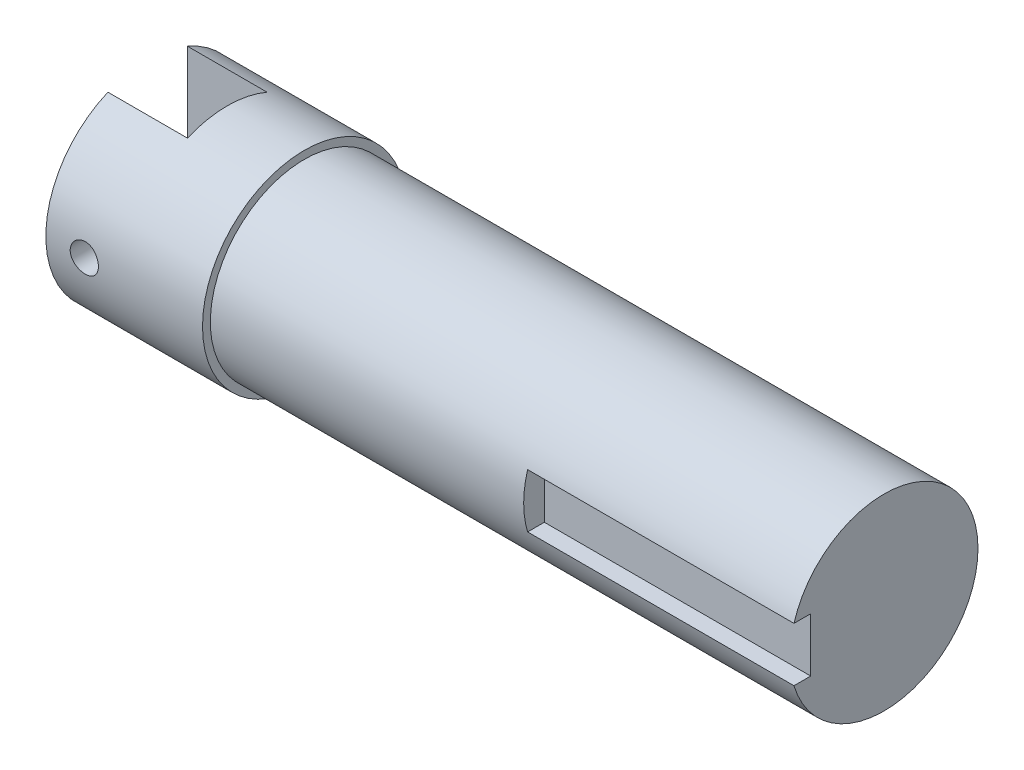
ISO-10303-21;
HEADER;
FILE_DESCRIPTION(('STEP AP214'),'2;1');
FILE_NAME('part.step','',(''),(''),'','','');
FILE_SCHEMA(('AUTOMOTIVE_DESIGN { 1 0 10303 214 1 1 1 1 }'));
ENDSEC;
DATA;
#1=APPLICATION_CONTEXT('core data for automotive mechanical design processes');
#2=APPLICATION_PROTOCOL_DEFINITION('international standard','automotive_design',2000,#1);
#3=PRODUCT_CONTEXT('',#1,'mechanical');
#4=PRODUCT('Part','Part','',(#3));
#5=PRODUCT_RELATED_PRODUCT_CATEGORY('part','',(#4));
#6=PRODUCT_DEFINITION_FORMATION('','',#4);
#7=PRODUCT_DEFINITION_CONTEXT('part definition',#1,'design');
#8=PRODUCT_DEFINITION('design','',#6,#7);
#9=PRODUCT_DEFINITION_SHAPE('','',#8);
#10=(LENGTH_UNIT() NAMED_UNIT(*) SI_UNIT(.MILLI.,.METRE.));
#11=(NAMED_UNIT(*) PLANE_ANGLE_UNIT() SI_UNIT($,.RADIAN.));
#12=(NAMED_UNIT(*) SI_UNIT($,.STERADIAN.) SOLID_ANGLE_UNIT());
#13=UNCERTAINTY_MEASURE_WITH_UNIT(LENGTH_MEASURE(1.E-05),#10,'distance_accuracy_value','');
#14=(GEOMETRIC_REPRESENTATION_CONTEXT(3) GLOBAL_UNCERTAINTY_ASSIGNED_CONTEXT((#13)) GLOBAL_UNIT_ASSIGNED_CONTEXT((#10,
#11,#12)) REPRESENTATION_CONTEXT('',''));
#15=CARTESIAN_POINT('',(0.,0.,0.));
#16=DIRECTION('',(0.,0.,1.));
#17=DIRECTION('',(1.,0.,0.));
#18=AXIS2_PLACEMENT_3D('',#15,#16,#17);
#19=CARTESIAN_POINT('',(-50.,0.,0.));
#20=DIRECTION('',(1.,0.,0.));
#21=DIRECTION('',(0.,0.,-1.));
#22=AXIS2_PLACEMENT_3D('',#19,#20,#21);
#23=CYLINDRICAL_SURFACE('',#22,32.5);
#24=CARTESIAN_POINT('',(0.,0.,0.));
#25=DIRECTION('',(-1.,0.,0.));
#26=DIRECTION('',(0.,0.,1.));
#27=AXIS2_PLACEMENT_3D('',#24,#25,#26);
#28=CIRCLE('',#27,32.5);
#29=CARTESIAN_POINT('',(0.,0.,32.5));
#30=VERTEX_POINT('',#29);
#31=EDGE_CURVE('E143',#30,#30,#28,.T.);
#32=ORIENTED_EDGE('',*,*,#31,.T.);
#33=EDGE_LOOP('',(#32));
#34=FACE_BOUND('',#33,.T.);
#35=DIRECTION('',(1.,0.,0.));
#36=VECTOR('',#35,1.);
#37=CARTESIAN_POINT('',(-50.,29.915882069563,12.7));
#38=LINE('',#37,#36);
#39=CARTESIAN_POINT('',(-50.,29.915882069563,12.7));
#40=VERTEX_POINT('',#39);
#41=CARTESIAN_POINT('',(-24.6,29.915882069563,12.7));
#42=VERTEX_POINT('',#41);
#43=EDGE_CURVE('E171',#40,#42,#38,.T.);
#44=ORIENTED_EDGE('',*,*,#43,.F.);
#45=CARTESIAN_POINT('',(-50.,0.,0.));
#46=DIRECTION('',(-1.,0.,0.));
#47=DIRECTION('',(0.,0.,1.));
#48=AXIS2_PLACEMENT_3D('',#45,#46,#47);
#49=CIRCLE('',#48,32.5);
#50=CARTESIAN_POINT('',(-50.,-29.915882069563,12.7));
#51=VERTEX_POINT('',#50);
#52=EDGE_CURVE('E135',#51,#40,#49,.T.);
#53=ORIENTED_EDGE('',*,*,#52,.F.);
#54=DIRECTION('',(1.,0.,0.));
#55=VECTOR('',#54,1.);
#56=CARTESIAN_POINT('',(-50.,-29.915882069563,12.7));
#57=LINE('',#56,#55);
#58=CARTESIAN_POINT('',(-24.6,-29.915882069563,12.7));
#59=VERTEX_POINT('',#58);
#60=EDGE_CURVE('E170',#59,#51,#57,.F.);
#61=ORIENTED_EDGE('',*,*,#60,.F.);
#62=CARTESIAN_POINT('',(-24.6,0.,0.));
#63=DIRECTION('',(-1.,0.,0.));
#64=DIRECTION('',(0.,0.,1.));
#65=AXIS2_PLACEMENT_3D('',#62,#63,#64);
#66=CIRCLE('',#65,32.5);
#67=CARTESIAN_POINT('',(-24.6,-29.915882069563,-12.7));
#68=VERTEX_POINT('',#67);
#69=EDGE_CURVE('E55',#68,#59,#66,.T.);
#70=ORIENTED_EDGE('',*,*,#69,.F.);
#71=DIRECTION('',(1.,0.,0.));
#72=VECTOR('',#71,1.);
#73=CARTESIAN_POINT('',(-50.,-29.915882069563,-12.7));
#74=LINE('',#73,#72);
#75=CARTESIAN_POINT('',(-50.,-29.915882069563,-12.7));
#76=VERTEX_POINT('',#75);
#77=EDGE_CURVE('E114',#68,#76,#74,.F.);
#78=ORIENTED_EDGE('',*,*,#77,.T.);
#79=CARTESIAN_POINT('',(-50.,29.915882069563,-12.7));
#80=VERTEX_POINT('',#79);
#81=EDGE_CURVE('E127',#80,#76,#49,.T.);
#82=ORIENTED_EDGE('',*,*,#81,.F.);
#83=DIRECTION('',(1.,0.,0.));
#84=VECTOR('',#83,1.);
#85=CARTESIAN_POINT('',(-50.,29.915882069563,-12.7));
#86=LINE('',#85,#84);
#87=CARTESIAN_POINT('',(-24.6,29.915882069563,-12.7));
#88=VERTEX_POINT('',#87);
#89=EDGE_CURVE('E62',#80,#88,#86,.T.);
#90=ORIENTED_EDGE('',*,*,#89,.T.);
#91=EDGE_CURVE('E11',#42,#88,#66,.T.);
#92=ORIENTED_EDGE('',*,*,#91,.F.);
#93=EDGE_LOOP('',(#44,#53,#61,#70,#78,#82,#90,#92));
#94=FACE_BOUND('',#93,.T.);
#95=CARTESIAN_POINT('',(-42.2297556983694,0.,32.5));
#96=CARTESIAN_POINT('',(-42.2297451677036,-0.251476713775578,32.4999961967984));
#97=CARTESIAN_POINT('',(-42.2086043939546,-0.50310478940474,32.4970505017367));
#98=CARTESIAN_POINT('',(-42.1246126299622,-0.999342758172016,32.4855829606299));
#99=CARTESIAN_POINT('',(-42.0617196039774,-1.2439453189056,32.4770554950366));
#100=CARTESIAN_POINT('',(-41.8961257537616,-1.71887765065578,32.4553838558711));
#101=CARTESIAN_POINT('',(-41.7934534322544,-1.94921750446027,32.4422429885323));
#102=CARTESIAN_POINT('',(-41.551281715441,-2.38935903564809,32.4128011760166));
#103=CARTESIAN_POINT('',(-41.4117880134298,-2.59916388127082,32.3965007194765));
#104=CARTESIAN_POINT('',(-41.0989361055868,-2.99372458135041,32.3624338055038));
#105=CARTESIAN_POINT('',(-40.9253801831463,-3.17832297301913,32.34465915659));
#106=CARTESIAN_POINT('',(-40.5497555990823,-3.51587326350804,32.3097122100158));
#107=CARTESIAN_POINT('',(-40.3476853918274,-3.66882344571174,32.2925399450709));
#108=CARTESIAN_POINT('',(-39.9197263672851,-3.9393363293882,32.2606621888148));
#109=CARTESIAN_POINT('',(-39.6937418159321,-4.05674893091849,32.2459672736233));
#110=CARTESIAN_POINT('',(-39.2250236093747,-4.25189485531683,32.2208182714461));
#111=CARTESIAN_POINT('',(-38.9822907321945,-4.32963001994773,32.2103639876219));
#112=CARTESIAN_POINT('',(-38.4886125042317,-4.44273029607437,32.1949595049808));
#113=CARTESIAN_POINT('',(-38.2377296385564,-4.47836332950903,32.1899745163225));
#114=CARTESIAN_POINT('',(-37.7334994758609,-4.5070773930153,32.1859670703542));
#115=CARTESIAN_POINT('',(-37.4801523003613,-4.50016051080444,32.186944320506));
#116=CARTESIAN_POINT('',(-36.9800653733341,-4.44419050668617,32.1947191037414));
#117=CARTESIAN_POINT('',(-36.7332916745216,-4.39543419051841,32.2014756379387));
#118=CARTESIAN_POINT('',(-36.2514622501809,-4.25763321097773,32.2199837109791));
#119=CARTESIAN_POINT('',(-36.0164068111022,-4.16858756327952,32.2317353718596));
#120=CARTESIAN_POINT('',(-35.5637740311881,-3.95242192943067,32.258955464481));
#121=CARTESIAN_POINT('',(-35.3462582569872,-3.82517465201875,32.274436287503));
#122=CARTESIAN_POINT('',(-34.9355545139508,-3.53630868635925,32.3073611719864));
#123=CARTESIAN_POINT('',(-34.7423679093103,-3.37468807208104,32.3248053434336));
#124=CARTESIAN_POINT('',(-34.3840849204299,-3.02002643822979,32.3598731155141));
#125=CARTESIAN_POINT('',(-34.2192413761775,-2.82672991685896,32.377496980523));
#126=CARTESIAN_POINT('',(-33.9242981803474,-2.41507855285903,32.4108001416562));
#127=CARTESIAN_POINT('',(-33.7941986430385,-2.19672362781936,32.4264794313849));
#128=CARTESIAN_POINT('',(-33.5724297309782,-1.7409462909971,32.454139828637));
#129=CARTESIAN_POINT('',(-33.4807780842477,-1.50351514330564,32.4661192295007));
#130=CARTESIAN_POINT('',(-33.3387171528008,-1.01642945157678,32.4850153198952));
#131=CARTESIAN_POINT('',(-33.2883054956737,-0.766775611549387,32.4919323006493));
#132=CARTESIAN_POINT('',(-33.2304876344266,-0.264515392173606,32.4998859786858));
#133=CARTESIAN_POINT('',(-33.2227334939367,-0.0119497903126556,32.5009702489016));
#134=CARTESIAN_POINT('',(-33.2495298205025,0.490877663116604,32.4972653278649));
#135=CARTESIAN_POINT('',(-33.2840791766062,0.741139575009299,32.492476290854));
#136=CARTESIAN_POINT('',(-33.3942125537434,1.23121489955244,32.4775923445856));
#137=CARTESIAN_POINT('',(-33.4696288059083,1.47106672978644,32.4675191335522));
#138=CARTESIAN_POINT('',(-33.6591794744278,1.9347203432569,32.4431934987228));
#139=CARTESIAN_POINT('',(-33.7733154709711,2.15852147099768,32.4289409043654));
#140=CARTESIAN_POINT('',(-34.0378943302182,2.58526237363048,32.3977242682124));
#141=CARTESIAN_POINT('',(-34.1885600150641,2.78806277681038,32.3807438102731));
#142=CARTESIAN_POINT('',(-34.5216087771067,3.16562300652935,32.3460174684232));
#143=CARTESIAN_POINT('',(-34.7039934123805,3.34038145479911,32.3282715469443));
#144=CARTESIAN_POINT('',(-35.0968440652709,3.6581478575641,32.2938654474841));
#145=CARTESIAN_POINT('',(-35.3074986019274,3.80092380777263,32.2772137856068));
#146=CARTESIAN_POINT('',(-35.7500037230946,4.04906448092933,32.2470272710179));
#147=CARTESIAN_POINT('',(-35.981853803799,4.15443009281,32.2334923442501));
#148=CARTESIAN_POINT('',(-36.4594494351649,4.32439176902625,32.2111317882919));
#149=CARTESIAN_POINT('',(-36.7051493298058,4.38911412693432,32.2022915842129));
#150=CARTESIAN_POINT('',(-37.2040616468359,4.47635645326582,32.1902812136673));
#151=CARTESIAN_POINT('',(-37.4572736323055,4.49887887126019,32.1871107180928));
#152=CARTESIAN_POINT('',(-37.9617121732623,4.50103014338553,32.1868097608989));
#153=CARTESIAN_POINT('',(-38.2129372200853,4.48102361290709,32.189627956089));
#154=CARTESIAN_POINT('',(-38.7084151715534,4.39946178518042,32.2008758407262));
#155=CARTESIAN_POINT('',(-38.9526680811706,4.33790651756229,32.2093055261716));
#156=CARTESIAN_POINT('',(-39.4271927753685,4.17511639123033,32.2308096274505));
#157=CARTESIAN_POINT('',(-39.6574721228238,4.07390322170887,32.2438815040708));
#158=CARTESIAN_POINT('',(-40.0978390927872,3.83470625888075,32.2732007003367));
#159=CARTESIAN_POINT('',(-40.3079262376124,3.69672159596941,32.2894480950772));
#160=CARTESIAN_POINT('',(-40.703803558774,3.38655978128656,32.323454064158));
#161=CARTESIAN_POINT('',(-40.8893804723867,3.21411164277081,32.3412239332684));
#162=CARTESIAN_POINT('',(-41.2290957062609,2.84048892484938,32.3761756740433));
#163=CARTESIAN_POINT('',(-41.3832266632331,2.63930763608215,32.3933574072095));
#164=CARTESIAN_POINT('',(-41.6563042237974,2.21283684805816,32.4252872449895));
#165=CARTESIAN_POINT('',(-41.7750834277696,1.98743931655715,32.4400236291611));
#166=CARTESIAN_POINT('',(-41.9729275895558,1.51980664796643,32.4652860630007));
#167=CARTESIAN_POINT('',(-42.0520346619281,1.27758967821949,32.4758165750478));
#168=CARTESIAN_POINT('',(-42.1498611194011,0.861835746844076,32.489011430211));
#169=CARTESIAN_POINT('',(-42.1797771351664,0.690893363532976,32.4931115113834));
#170=CARTESIAN_POINT('',(-42.2197279568701,0.346657949921302,32.4986070939359));
#171=CARTESIAN_POINT('',(-42.2297629580804,0.173364942725462,32.5000026218803));
#172=CARTESIAN_POINT('',(-42.2297556983694,0.,32.5));
#173=B_SPLINE_CURVE_WITH_KNOTS('',3,(#95,#96,#97,#98,#99,#100,#101,#102,#103,#104,#105,#106,
#107,#108,#109,#110,#111,#112,#113,#114,#115,#116,#117,#118,#119,#120,#121,#122,#123,#124,#125,
#126,#127,#128,#129,#130,#131,#132,#133,#134,#135,#136,#137,#138,#139,#140,#141,#142,#143,#144,
#145,#146,#147,#148,#149,#150,#151,#152,#153,#154,#155,#156,#157,#158,#159,#160,#161,#162,#163,
#164,#165,#166,#167,#168,#169,#170,#171,#172),.UNSPECIFIED.,.T.,.F.,(4,2,2,2,2,2,2,2,2,2,2,2,2,
2,2,2,2,2,2,2,2,2,2,2,2,2,2,2,2,2,2,2,2,2,2,2,2,2,4),(0.,0.753796769010256,1.50835360619536,
2.2623707840264,3.01627144448885,3.77468500241174,4.53313968633046,5.29475453026309,
6.05633401804302,6.81304054510393,7.5697099445499,8.32105554826591,9.0724195094075,
9.82631540716196,10.5802535588686,11.3406029574705,12.1009548567352,12.8616569639685,
13.6223153072524,14.3767600322741,15.1311849448957,15.8825359613667,16.6339176448591,
17.3900032766185,18.1461260588065,18.9075679559686,19.6689917587806,20.4280376745418,
21.1870395287609,21.9395604543382,22.6920808432625,23.4441902465277,24.1963174379175,
24.9546093969473,25.7130787120364,26.4750844303599,27.2362795084214,27.7559428017142,
28.2756009908328),.UNSPECIFIED.);
#174=CARTESIAN_POINT('',(-42.2297556983694,0.,32.5));
#175=VERTEX_POINT('',#174);
#176=EDGE_CURVE('E253',#175,#175,#173,.T.);
#177=ORIENTED_EDGE('',*,*,#176,.F.);
#178=EDGE_LOOP('',(#177));
#179=FACE_BOUND('',#178,.T.);
#180=CARTESIAN_POINT('',(-42.2297556983694,0.,-32.5));
#181=CARTESIAN_POINT('',(-42.2297451677036,0.251476713775578,-32.4999961967984));
#182=CARTESIAN_POINT('',(-42.2086043939546,0.50310478940474,-32.4970505017367));
#183=CARTESIAN_POINT('',(-42.1246126299622,0.999342758172016,-32.4855829606299));
#184=CARTESIAN_POINT('',(-42.0617196039774,1.2439453189056,-32.4770554950366));
#185=CARTESIAN_POINT('',(-41.8961257537616,1.71887765065578,-32.4553838558711));
#186=CARTESIAN_POINT('',(-41.7934534322544,1.94921750446027,-32.4422429885323));
#187=CARTESIAN_POINT('',(-41.551281715441,2.38935903564809,-32.4128011760166));
#188=CARTESIAN_POINT('',(-41.4117880134298,2.59916388127082,-32.3965007194765));
#189=CARTESIAN_POINT('',(-41.0989361055868,2.99372458135041,-32.3624338055038));
#190=CARTESIAN_POINT('',(-40.9253801831463,3.17832297301913,-32.34465915659));
#191=CARTESIAN_POINT('',(-40.5497555990823,3.51587326350804,-32.3097122100158));
#192=CARTESIAN_POINT('',(-40.3476853918274,3.66882344571174,-32.2925399450709));
#193=CARTESIAN_POINT('',(-39.9197263672851,3.9393363293882,-32.2606621888148));
#194=CARTESIAN_POINT('',(-39.6937418159321,4.05674893091849,-32.2459672736233));
#195=CARTESIAN_POINT('',(-39.2250236093747,4.25189485531683,-32.2208182714461));
#196=CARTESIAN_POINT('',(-38.9822907321945,4.32963001994773,-32.2103639876219));
#197=CARTESIAN_POINT('',(-38.4886125042317,4.44273029607437,-32.1949595049808));
#198=CARTESIAN_POINT('',(-38.2377296385564,4.47836332950903,-32.1899745163225));
#199=CARTESIAN_POINT('',(-37.7334994758609,4.5070773930153,-32.1859670703542));
#200=CARTESIAN_POINT('',(-37.4801523003613,4.50016051080444,-32.186944320506));
#201=CARTESIAN_POINT('',(-36.9800653733341,4.44419050668617,-32.1947191037414));
#202=CARTESIAN_POINT('',(-36.7332916745216,4.39543419051841,-32.2014756379387));
#203=CARTESIAN_POINT('',(-36.2514622501809,4.25763321097773,-32.2199837109791));
#204=CARTESIAN_POINT('',(-36.0164068111022,4.16858756327952,-32.2317353718596));
#205=CARTESIAN_POINT('',(-35.5637740311881,3.95242192943067,-32.258955464481));
#206=CARTESIAN_POINT('',(-35.3462582569872,3.82517465201875,-32.274436287503));
#207=CARTESIAN_POINT('',(-34.9355545139508,3.53630868635925,-32.3073611719864));
#208=CARTESIAN_POINT('',(-34.7423679093103,3.37468807208104,-32.3248053434336));
#209=CARTESIAN_POINT('',(-34.3840849204299,3.02002643822979,-32.3598731155141));
#210=CARTESIAN_POINT('',(-34.2192413761775,2.82672991685896,-32.377496980523));
#211=CARTESIAN_POINT('',(-33.9242981803474,2.41507855285903,-32.4108001416562));
#212=CARTESIAN_POINT('',(-33.7941986430385,2.19672362781936,-32.4264794313849));
#213=CARTESIAN_POINT('',(-33.5724297309782,1.7409462909971,-32.454139828637));
#214=CARTESIAN_POINT('',(-33.4807780842477,1.50351514330564,-32.4661192295007));
#215=CARTESIAN_POINT('',(-33.3387171528008,1.01642945157678,-32.4850153198952));
#216=CARTESIAN_POINT('',(-33.2883054956737,0.766775611549387,-32.4919323006493));
#217=CARTESIAN_POINT('',(-33.2304876344266,0.264515392173606,-32.4998859786858));
#218=CARTESIAN_POINT('',(-33.2227334939367,0.0119497903126556,-32.5009702489016));
#219=CARTESIAN_POINT('',(-33.2495298205025,-0.490877663116604,-32.4972653278649));
#220=CARTESIAN_POINT('',(-33.2840791766062,-0.741139575009299,-32.492476290854));
#221=CARTESIAN_POINT('',(-33.3942125537434,-1.23121489955244,-32.4775923445856));
#222=CARTESIAN_POINT('',(-33.4696288059083,-1.47106672978644,-32.4675191335522));
#223=CARTESIAN_POINT('',(-33.6591794744278,-1.9347203432569,-32.4431934987228));
#224=CARTESIAN_POINT('',(-33.7733154709711,-2.15852147099768,-32.4289409043654));
#225=CARTESIAN_POINT('',(-34.0378943302182,-2.58526237363048,-32.3977242682124));
#226=CARTESIAN_POINT('',(-34.1885600150641,-2.78806277681038,-32.3807438102731));
#227=CARTESIAN_POINT('',(-34.5216087771067,-3.16562300652935,-32.3460174684232));
#228=CARTESIAN_POINT('',(-34.7039934123805,-3.34038145479911,-32.3282715469443));
#229=CARTESIAN_POINT('',(-35.0968440652709,-3.6581478575641,-32.2938654474841));
#230=CARTESIAN_POINT('',(-35.3074986019274,-3.80092380777263,-32.2772137856068));
#231=CARTESIAN_POINT('',(-35.7500037230946,-4.04906448092933,-32.2470272710179));
#232=CARTESIAN_POINT('',(-35.981853803799,-4.15443009281,-32.2334923442501));
#233=CARTESIAN_POINT('',(-36.4594494351649,-4.32439176902625,-32.2111317882919));
#234=CARTESIAN_POINT('',(-36.7051493298058,-4.38911412693432,-32.2022915842129));
#235=CARTESIAN_POINT('',(-37.2040616468359,-4.47635645326582,-32.1902812136673));
#236=CARTESIAN_POINT('',(-37.4572736323055,-4.49887887126019,-32.1871107180928));
#237=CARTESIAN_POINT('',(-37.9617121732623,-4.50103014338553,-32.1868097608989));
#238=CARTESIAN_POINT('',(-38.2129372200853,-4.48102361290709,-32.189627956089));
#239=CARTESIAN_POINT('',(-38.7084151715534,-4.39946178518042,-32.2008758407262));
#240=CARTESIAN_POINT('',(-38.9526680811706,-4.33790651756229,-32.2093055261716));
#241=CARTESIAN_POINT('',(-39.4271927753685,-4.17511639123033,-32.2308096274505));
#242=CARTESIAN_POINT('',(-39.6574721228238,-4.07390322170887,-32.2438815040708));
#243=CARTESIAN_POINT('',(-40.0978390927872,-3.83470625888075,-32.2732007003367));
#244=CARTESIAN_POINT('',(-40.3079262376124,-3.69672159596941,-32.2894480950772));
#245=CARTESIAN_POINT('',(-40.703803558774,-3.38655978128656,-32.323454064158));
#246=CARTESIAN_POINT('',(-40.8893804723867,-3.21411164277081,-32.3412239332684));
#247=CARTESIAN_POINT('',(-41.2290957062609,-2.84048892484938,-32.3761756740433));
#248=CARTESIAN_POINT('',(-41.3832266632331,-2.63930763608215,-32.3933574072095));
#249=CARTESIAN_POINT('',(-41.6563042237974,-2.21283684805816,-32.4252872449895));
#250=CARTESIAN_POINT('',(-41.7750834277696,-1.98743931655715,-32.4400236291611));
#251=CARTESIAN_POINT('',(-41.9729275895558,-1.51980664796643,-32.4652860630007));
#252=CARTESIAN_POINT('',(-42.0520346619281,-1.27758967821949,-32.4758165750478));
#253=CARTESIAN_POINT('',(-42.1498611194011,-0.861835746844076,-32.489011430211));
#254=CARTESIAN_POINT('',(-42.1797771351664,-0.690893363532976,-32.4931115113834));
#255=CARTESIAN_POINT('',(-42.2197279568701,-0.346657949921302,-32.4986070939359));
#256=CARTESIAN_POINT('',(-42.2297629580804,-0.173364942725462,-32.5000026218803));
#257=CARTESIAN_POINT('',(-42.2297556983694,0.,-32.5));
#258=B_SPLINE_CURVE_WITH_KNOTS('',3,(#180,#181,#182,#183,#184,#185,#186,#187,#188,#189,#190,
#191,#192,#193,#194,#195,#196,#197,#198,#199,#200,#201,#202,#203,#204,#205,#206,#207,#208,#209,
#210,#211,#212,#213,#214,#215,#216,#217,#218,#219,#220,#221,#222,#223,#224,#225,#226,#227,#228,
#229,#230,#231,#232,#233,#234,#235,#236,#237,#238,#239,#240,#241,#242,#243,#244,#245,#246,#247,
#248,#249,#250,#251,#252,#253,#254,#255,#256,#257),.UNSPECIFIED.,.T.,.F.,(4,2,2,2,2,2,2,2,2,2,2,
2,2,2,2,2,2,2,2,2,2,2,2,2,2,2,2,2,2,2,2,2,2,2,2,2,2,2,4),(0.,0.753796769010256,1.50835360619536,
2.2623707840264,3.01627144448885,3.77468500241174,4.53313968633046,5.29475453026309,
6.05633401804302,6.81304054510393,7.5697099445499,8.32105554826591,9.0724195094075,
9.82631540716196,10.5802535588686,11.3406029574705,12.1009548567352,12.8616569639685,
13.6223153072524,14.3767600322741,15.1311849448957,15.8825359613667,16.6339176448591,
17.3900032766185,18.1461260588065,18.9075679559686,19.6689917587806,20.4280376745418,
21.1870395287609,21.9395604543382,22.6920808432625,23.4441902465277,24.1963174379175,
24.9546093969473,25.7130787120364,26.4750844303599,27.2362795084214,27.7559428017142,
28.2756009908328),.UNSPECIFIED.);
#259=CARTESIAN_POINT('',(-42.2297556983694,0.,-32.5));
#260=VERTEX_POINT('',#259);
#261=EDGE_CURVE('E260',#260,#260,#258,.T.);
#262=ORIENTED_EDGE('',*,*,#261,.F.);
#263=EDGE_LOOP('',(#262));
#264=FACE_BOUND('',#263,.T.);
#265=ADVANCED_FACE('F45',(#34,#94,#179,#264),#23,.T.);
#266=CARTESIAN_POINT('',(-50.,0.,0.));
#267=DIRECTION('',(-1.,0.,0.));
#268=DIRECTION('',(0.,0.,1.));
#269=AXIS2_PLACEMENT_3D('',#266,#267,#268);
#270=PLANE('',#269);
#271=ORIENTED_EDGE('',*,*,#52,.T.);
#272=DIRECTION('',(0.,-1.,0.));
#273=VECTOR('',#272,1.);
#274=CARTESIAN_POINT('',(-50.,0.,12.7));
#275=LINE('',#274,#273);
#276=EDGE_CURVE('E120',#40,#51,#275,.T.);
#277=ORIENTED_EDGE('',*,*,#276,.T.);
#278=EDGE_LOOP('',(#271,#277));
#279=FACE_BOUND('',#278,.T.);
#280=ADVANCED_FACE('F240',(#279),#270,.T.);
#281=CARTESIAN_POINT('',(185.,0.,0.));
#282=DIRECTION('',(-1.,0.,0.));
#283=DIRECTION('',(0.,0.,1.));
#284=AXIS2_PLACEMENT_3D('',#281,#282,#283);
#285=CYLINDRICAL_SURFACE('',#284,30.);
#286=CARTESIAN_POINT('',(185.,0.,0.));
#287=DIRECTION('',(1.,0.,0.));
#288=DIRECTION('',(0.,0.,-1.));
#289=AXIS2_PLACEMENT_3D('',#286,#287,#288);
#290=CIRCLE('',#289,30.);
#291=CARTESIAN_POINT('',(185.,-8.6135173493858,28.7368634139468));
#292=VERTEX_POINT('',#291);
#293=CARTESIAN_POINT('',(185.,8.61351734938581,28.7368634139468));
#294=VERTEX_POINT('',#293);
#295=EDGE_CURVE('E140',#292,#294,#290,.T.);
#296=ORIENTED_EDGE('',*,*,#295,.F.);
#297=DIRECTION('',(-1.,0.,0.));
#298=VECTOR('',#297,1.);
#299=CARTESIAN_POINT('',(185.,-8.6135173493858,28.7368634139468));
#300=LINE('',#299,#298);
#301=CARTESIAN_POINT('',(100.,-8.6135173493858,28.7368634139468));
#302=VERTEX_POINT('',#301);
#303=EDGE_CURVE('E146',#292,#302,#300,.T.);
#304=ORIENTED_EDGE('',*,*,#303,.T.);
#305=CARTESIAN_POINT('',(100.,0.,0.));
#306=DIRECTION('',(1.,0.,0.));
#307=DIRECTION('',(0.,0.,-1.));
#308=AXIS2_PLACEMENT_3D('',#305,#306,#307);
#309=CIRCLE('',#308,30.);
#310=CARTESIAN_POINT('',(100.,8.6135173493858,28.7368634139468));
#311=VERTEX_POINT('',#310);
#312=EDGE_CURVE('E121',#311,#302,#309,.T.);
#313=ORIENTED_EDGE('',*,*,#312,.F.);
#314=DIRECTION('',(-1.,0.,0.));
#315=VECTOR('',#314,1.);
#316=CARTESIAN_POINT('',(185.,8.6135173493858,28.7368634139468));
#317=LINE('',#316,#315);
#318=EDGE_CURVE('E202',#311,#294,#317,.F.);
#319=ORIENTED_EDGE('',*,*,#318,.T.);
#320=EDGE_LOOP('',(#296,#304,#313,#319));
#321=FACE_BOUND('',#320,.T.);
#322=CARTESIAN_POINT('',(0.,0.,0.));
#323=DIRECTION('',(1.,0.,0.));
#324=DIRECTION('',(0.,0.,-1.));
#325=AXIS2_PLACEMENT_3D('',#322,#323,#324);
#326=CIRCLE('',#325,30.);
#327=CARTESIAN_POINT('',(0.,0.,-30.));
#328=VERTEX_POINT('',#327);
#329=EDGE_CURVE('E134',#328,#328,#326,.T.);
#330=ORIENTED_EDGE('',*,*,#329,.T.);
#331=EDGE_LOOP('',(#330));
#332=FACE_BOUND('',#331,.T.);
#333=ADVANCED_FACE('F47',(#321,#332),#285,.T.);
#334=CARTESIAN_POINT('',(185.,0.,0.));
#335=DIRECTION('',(1.,0.,0.));
#336=DIRECTION('',(0.,0.,-1.));
#337=AXIS2_PLACEMENT_3D('',#334,#335,#336);
#338=PLANE('',#337);
#339=DIRECTION('',(0.,0.,-1.));
#340=VECTOR('',#339,1.);
#341=CARTESIAN_POINT('',(185.,-8.61351734938583,0.));
#342=LINE('',#341,#340);
#343=CARTESIAN_POINT('',(185.,-8.61351734938581,23.4));
#344=VERTEX_POINT('',#343);
#345=EDGE_CURVE('E153',#292,#344,#342,.T.);
#346=ORIENTED_EDGE('',*,*,#345,.F.);
#347=ORIENTED_EDGE('',*,*,#295,.T.);
#348=DIRECTION('',(0.,0.,1.));
#349=VECTOR('',#348,1.);
#350=CARTESIAN_POINT('',(185.,8.6135173493858,34.4));
#351=LINE('',#350,#349);
#352=CARTESIAN_POINT('',(185.,8.61351734938581,23.4));
#353=VERTEX_POINT('',#352);
#354=EDGE_CURVE('E187',#353,#294,#351,.T.);
#355=ORIENTED_EDGE('',*,*,#354,.F.);
#356=DIRECTION('',(0.,1.,0.));
#357=VECTOR('',#356,1.);
#358=CARTESIAN_POINT('',(185.,-8.61351734938581,23.4));
#359=LINE('',#358,#357);
#360=EDGE_CURVE('E179',#344,#353,#359,.T.);
#361=ORIENTED_EDGE('',*,*,#360,.F.);
#362=EDGE_LOOP('',(#346,#347,#355,#361));
#363=FACE_BOUND('',#362,.T.);
#364=ADVANCED_FACE('F218',(#363),#338,.T.);
#365=DIRECTION('',(0.,-1.,0.));
#366=VECTOR('',#365,1.);
#367=CARTESIAN_POINT('',(-50.,0.,-12.7));
#368=LINE('',#367,#366);
#369=EDGE_CURVE('E111',#80,#76,#368,.T.);
#370=ORIENTED_EDGE('',*,*,#369,.F.);
#371=ORIENTED_EDGE('',*,*,#81,.T.);
#372=EDGE_LOOP('',(#370,#371));
#373=FACE_BOUND('',#372,.T.);
#374=ADVANCED_FACE('F132',(#373),#270,.T.);
#375=CARTESIAN_POINT('',(0.,0.,0.));
#376=DIRECTION('',(-1.,0.,0.));
#377=DIRECTION('',(0.,0.,1.));
#378=AXIS2_PLACEMENT_3D('',#375,#376,#377);
#379=PLANE('',#378);
#380=ORIENTED_EDGE('',*,*,#329,.F.);
#381=EDGE_LOOP('',(#380));
#382=FACE_BOUND('',#381,.T.);
#383=ORIENTED_EDGE('',*,*,#31,.F.);
#384=EDGE_LOOP('',(#383));
#385=FACE_BOUND('',#384,.T.);
#386=ADVANCED_FACE('F227',(#382,#385),#379,.F.);
#387=CARTESIAN_POINT('',(100.,0.,0.));
#388=DIRECTION('',(1.,0.,0.));
#389=DIRECTION('',(0.,0.,-1.));
#390=AXIS2_PLACEMENT_3D('',#387,#388,#389);
#391=PLANE('',#390);
#392=ORIENTED_EDGE('',*,*,#312,.T.);
#393=DIRECTION('',(0.,0.,-1.));
#394=VECTOR('',#393,1.);
#395=CARTESIAN_POINT('',(100.,-8.61351734938579,34.4));
#396=LINE('',#395,#394);
#397=CARTESIAN_POINT('',(100.,-8.61351734938581,23.4));
#398=VERTEX_POINT('',#397);
#399=EDGE_CURVE('E183',#302,#398,#396,.T.);
#400=ORIENTED_EDGE('',*,*,#399,.T.);
#401=DIRECTION('',(0.,1.,0.));
#402=VECTOR('',#401,1.);
#403=CARTESIAN_POINT('',(100.,-8.61351734938581,23.4));
#404=LINE('',#403,#402);
#405=CARTESIAN_POINT('',(100.,8.61351734938581,23.4));
#406=VERTEX_POINT('',#405);
#407=EDGE_CURVE('E186',#398,#406,#404,.T.);
#408=ORIENTED_EDGE('',*,*,#407,.T.);
#409=DIRECTION('',(0.,0.,1.));
#410=VECTOR('',#409,1.);
#411=CARTESIAN_POINT('',(100.,8.6135173493858,34.4));
#412=LINE('',#411,#410);
#413=EDGE_CURVE('E191',#406,#311,#412,.T.);
#414=ORIENTED_EDGE('',*,*,#413,.T.);
#415=EDGE_LOOP('',(#392,#400,#408,#414));
#416=FACE_BOUND('',#415,.T.);
#417=ADVANCED_FACE('F225',(#416),#391,.T.);
#418=CARTESIAN_POINT('',(100.,-8.61351734938579,34.4));
#419=DIRECTION('',(0.,-1.,0.));
#420=DIRECTION('',(0.,0.,-1.));
#421=AXIS2_PLACEMENT_3D('',#418,#419,#420);
#422=PLANE('',#421);
#423=ORIENTED_EDGE('',*,*,#345,.T.);
#424=DIRECTION('',(1.,0.,0.));
#425=VECTOR('',#424,1.);
#426=CARTESIAN_POINT('',(100.,-8.61351734938581,23.4));
#427=LINE('',#426,#425);
#428=EDGE_CURVE('E70',#398,#344,#427,.T.);
#429=ORIENTED_EDGE('',*,*,#428,.F.);
#430=ORIENTED_EDGE('',*,*,#399,.F.);
#431=ORIENTED_EDGE('',*,*,#303,.F.);
#432=EDGE_LOOP('',(#423,#429,#430,#431));
#433=FACE_BOUND('',#432,.T.);
#434=ADVANCED_FACE('F215',(#433),#422,.F.);
#435=CARTESIAN_POINT('',(100.,8.6135173493858,34.4));
#436=DIRECTION('',(0.,1.,0.));
#437=DIRECTION('',(0.,0.,1.));
#438=AXIS2_PLACEMENT_3D('',#435,#436,#437);
#439=PLANE('',#438);
#440=ORIENTED_EDGE('',*,*,#413,.F.);
#441=DIRECTION('',(1.,0.,0.));
#442=VECTOR('',#441,1.);
#443=CARTESIAN_POINT('',(100.,8.61351734938581,23.4));
#444=LINE('',#443,#442);
#445=EDGE_CURVE('E199',#406,#353,#444,.T.);
#446=ORIENTED_EDGE('',*,*,#445,.T.);
#447=ORIENTED_EDGE('',*,*,#354,.T.);
#448=ORIENTED_EDGE('',*,*,#318,.F.);
#449=EDGE_LOOP('',(#440,#446,#447,#448));
#450=FACE_BOUND('',#449,.T.);
#451=ADVANCED_FACE('F223',(#450),#439,.F.);
#452=CARTESIAN_POINT('',(100.,-8.61351734938581,23.4));
#453=DIRECTION('',(0.,0.,-1.));
#454=DIRECTION('',(0.,1.,0.));
#455=AXIS2_PLACEMENT_3D('',#452,#453,#454);
#456=PLANE('',#455);
#457=ORIENTED_EDGE('',*,*,#360,.T.);
#458=ORIENTED_EDGE('',*,*,#445,.F.);
#459=ORIENTED_EDGE('',*,*,#407,.F.);
#460=ORIENTED_EDGE('',*,*,#428,.T.);
#461=EDGE_LOOP('',(#457,#458,#459,#460));
#462=FACE_BOUND('',#461,.T.);
#463=ADVANCED_FACE('F220',(#462),#456,.F.);
#464=CARTESIAN_POINT('',(-24.6,0.,0.));
#465=DIRECTION('',(-1.,0.,0.));
#466=DIRECTION('',(0.,0.,1.));
#467=AXIS2_PLACEMENT_3D('',#464,#465,#466);
#468=PLANE('',#467);
#469=ORIENTED_EDGE('',*,*,#91,.T.);
#470=DIRECTION('',(0.,-1.,0.));
#471=VECTOR('',#470,1.);
#472=CARTESIAN_POINT('',(-24.6,45.1644459567815,-12.7));
#473=LINE('',#472,#471);
#474=EDGE_CURVE('E167',#88,#68,#473,.T.);
#475=ORIENTED_EDGE('',*,*,#474,.T.);
#476=ORIENTED_EDGE('',*,*,#69,.T.);
#477=DIRECTION('',(0.,-1.,0.));
#478=VECTOR('',#477,1.);
#479=CARTESIAN_POINT('',(-24.6,45.1644459567815,12.7));
#480=LINE('',#479,#478);
#481=EDGE_CURVE('E130',#42,#59,#480,.T.);
#482=ORIENTED_EDGE('',*,*,#481,.F.);
#483=EDGE_LOOP('',(#469,#475,#476,#482));
#484=FACE_BOUND('',#483,.T.);
#485=ADVANCED_FACE('F165',(#484),#468,.T.);
#486=CARTESIAN_POINT('',(-24.6,45.1644459567815,12.7));
#487=DIRECTION('',(0.,0.,-1.));
#488=DIRECTION('',(-1.,0.,0.));
#489=AXIS2_PLACEMENT_3D('',#486,#487,#488);
#490=PLANE('',#489);
#491=CARTESIAN_POINT('',(-37.7297556983694,0.,12.7));
#492=DIRECTION('',(0.,0.,-1.));
#493=DIRECTION('',(-1.,0.,0.));
#494=AXIS2_PLACEMENT_3D('',#491,#492,#493);
#495=CIRCLE('',#494,4.5);
#496=CARTESIAN_POINT('',(-42.2297556983694,0.,12.7));
#497=VERTEX_POINT('',#496);
#498=EDGE_CURVE('E283',#497,#497,#495,.F.);
#499=ORIENTED_EDGE('',*,*,#498,.T.);
#500=EDGE_LOOP('',(#499));
#501=FACE_BOUND('',#500,.T.);
#502=ORIENTED_EDGE('',*,*,#43,.T.);
#503=ORIENTED_EDGE('',*,*,#481,.T.);
#504=ORIENTED_EDGE('',*,*,#60,.T.);
#505=ORIENTED_EDGE('',*,*,#276,.F.);
#506=EDGE_LOOP('',(#502,#503,#504,#505));
#507=FACE_BOUND('',#506,.T.);
#508=ADVANCED_FACE('F169',(#501,#507),#490,.T.);
#509=CARTESIAN_POINT('',(-24.6,45.1644459567815,-12.7));
#510=DIRECTION('',(0.,0.,-1.));
#511=DIRECTION('',(-1.,0.,0.));
#512=AXIS2_PLACEMENT_3D('',#509,#510,#511);
#513=PLANE('',#512);
#514=CARTESIAN_POINT('',(-37.7297556983694,0.,-12.7));
#515=DIRECTION('',(0.,0.,-1.));
#516=DIRECTION('',(-1.,0.,0.));
#517=AXIS2_PLACEMENT_3D('',#514,#515,#516);
#518=CIRCLE('',#517,4.5);
#519=CARTESIAN_POINT('',(-42.2297556983694,0.,-12.7));
#520=VERTEX_POINT('',#519);
#521=EDGE_CURVE('E49',#520,#520,#518,.F.);
#522=ORIENTED_EDGE('',*,*,#521,.F.);
#523=EDGE_LOOP('',(#522));
#524=FACE_BOUND('',#523,.T.);
#525=ORIENTED_EDGE('',*,*,#369,.T.);
#526=ORIENTED_EDGE('',*,*,#77,.F.);
#527=ORIENTED_EDGE('',*,*,#474,.F.);
#528=ORIENTED_EDGE('',*,*,#89,.F.);
#529=EDGE_LOOP('',(#525,#526,#527,#528));
#530=FACE_BOUND('',#529,.T.);
#531=ADVANCED_FACE('F113',(#524,#530),#513,.F.);
#532=CARTESIAN_POINT('',(-37.7297556983694,0.,53.7));
#533=DIRECTION('',(0.,0.,-1.));
#534=DIRECTION('',(-1.,0.,0.));
#535=AXIS2_PLACEMENT_3D('',#532,#533,#534);
#536=CYLINDRICAL_SURFACE('',#535,4.5);
#537=ORIENTED_EDGE('',*,*,#521,.T.);
#538=EDGE_LOOP('',(#537));
#539=FACE_BOUND('',#538,.T.);
#540=ORIENTED_EDGE('',*,*,#261,.T.);
#541=EDGE_LOOP('',(#540));
#542=FACE_BOUND('',#541,.T.);
#543=ADVANCED_FACE('F267',(#539,#542),#536,.F.);
#544=ORIENTED_EDGE('',*,*,#498,.F.);
#545=EDGE_LOOP('',(#544));
#546=FACE_BOUND('',#545,.T.);
#547=ORIENTED_EDGE('',*,*,#176,.T.);
#548=EDGE_LOOP('',(#547));
#549=FACE_BOUND('',#548,.T.);
#550=ADVANCED_FACE('F271',(#546,#549),#536,.F.);
#551=CLOSED_SHELL('',(#265,#280,#333,#364,#374,#386,#417,#434,#451,#463,#485,#508,#531,#543,#550));
#552=MANIFOLD_SOLID_BREP('B2',#551);
#553=ADVANCED_BREP_SHAPE_REPRESENTATION('',(#18,#552),#14);
#554=SHAPE_DEFINITION_REPRESENTATION(#9,#553);
ENDSEC;
END-ISO-10303-21;
